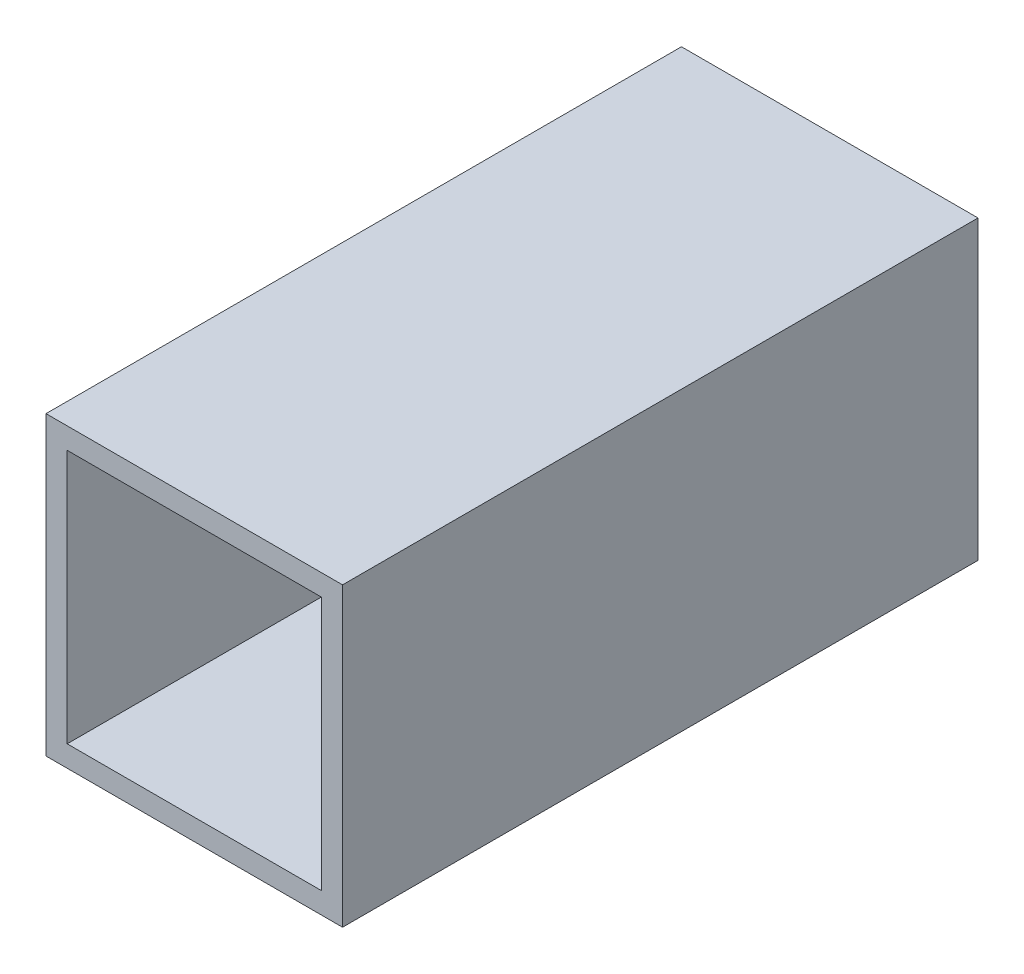
ISO-10303-21;
HEADER;
FILE_DESCRIPTION(('STEP AP214'),'2;1');
FILE_NAME('part.step','',(''),(''),'','','');
FILE_SCHEMA(('AUTOMOTIVE_DESIGN { 1 0 10303 214 1 1 1 1 }'));
ENDSEC;
DATA;
#1=APPLICATION_CONTEXT('core data for automotive mechanical design processes');
#2=APPLICATION_PROTOCOL_DEFINITION('international standard','automotive_design',2000,#1);
#3=PRODUCT_CONTEXT('',#1,'mechanical');
#4=PRODUCT('Part','Part','',(#3));
#5=PRODUCT_RELATED_PRODUCT_CATEGORY('part','',(#4));
#6=PRODUCT_DEFINITION_FORMATION('','',#4);
#7=PRODUCT_DEFINITION_CONTEXT('part definition',#1,'design');
#8=PRODUCT_DEFINITION('design','',#6,#7);
#9=PRODUCT_DEFINITION_SHAPE('','',#8);
#10=(LENGTH_UNIT() NAMED_UNIT(*) SI_UNIT(.MILLI.,.METRE.));
#11=(NAMED_UNIT(*) PLANE_ANGLE_UNIT() SI_UNIT($,.RADIAN.));
#12=(NAMED_UNIT(*) SI_UNIT($,.STERADIAN.) SOLID_ANGLE_UNIT());
#13=UNCERTAINTY_MEASURE_WITH_UNIT(LENGTH_MEASURE(1.E-05),#10,'distance_accuracy_value','');
#14=(GEOMETRIC_REPRESENTATION_CONTEXT(3) GLOBAL_UNCERTAINTY_ASSIGNED_CONTEXT((#13)) GLOBAL_UNIT_ASSIGNED_CONTEXT((#10,
#11,#12)) REPRESENTATION_CONTEXT('',''));
#15=CARTESIAN_POINT('',(0.,0.,0.));
#16=DIRECTION('',(0.,0.,1.));
#17=DIRECTION('',(1.,0.,0.));
#18=AXIS2_PLACEMENT_3D('',#15,#16,#17);
#19=CARTESIAN_POINT('',(0.,0.,95.25));
#20=DIRECTION('',(0.,0.,1.));
#21=DIRECTION('',(1.,0.,0.));
#22=AXIS2_PLACEMENT_3D('',#19,#20,#21);
#23=PLANE('',#22);
#24=DIRECTION('',(0.,1.,0.));
#25=VECTOR('',#24,1.);
#26=CARTESIAN_POINT('',(22.225,22.225,95.25));
#27=LINE('',#26,#25);
#28=CARTESIAN_POINT('',(22.225,-22.225,95.25));
#29=VERTEX_POINT('',#28);
#30=CARTESIAN_POINT('',(22.225,22.225,95.25));
#31=VERTEX_POINT('',#30);
#32=EDGE_CURVE('E134',#29,#31,#27,.T.);
#33=ORIENTED_EDGE('',*,*,#32,.T.);
#34=DIRECTION('',(-1.,0.,0.));
#35=VECTOR('',#34,1.);
#36=CARTESIAN_POINT('',(-22.225,22.225,95.25));
#37=LINE('',#36,#35);
#38=CARTESIAN_POINT('',(-22.225,22.225,95.25));
#39=VERTEX_POINT('',#38);
#40=EDGE_CURVE('E137',#31,#39,#37,.T.);
#41=ORIENTED_EDGE('',*,*,#40,.T.);
#42=DIRECTION('',(0.,-1.,0.));
#43=VECTOR('',#42,1.);
#44=CARTESIAN_POINT('',(-22.225,22.225,95.25));
#45=LINE('',#44,#43);
#46=CARTESIAN_POINT('',(-22.225,-22.225,95.25));
#47=VERTEX_POINT('',#46);
#48=EDGE_CURVE('E140',#39,#47,#45,.T.);
#49=ORIENTED_EDGE('',*,*,#48,.T.);
#50=DIRECTION('',(1.,0.,0.));
#51=VECTOR('',#50,1.);
#52=CARTESIAN_POINT('',(-22.225,-22.225,95.25));
#53=LINE('',#52,#51);
#54=EDGE_CURVE('E142',#47,#29,#53,.T.);
#55=ORIENTED_EDGE('',*,*,#54,.T.);
#56=EDGE_LOOP('',(#33,#41,#49,#55));
#57=FACE_BOUND('',#56,.T.);
#58=DIRECTION('',(-1.,0.,0.));
#59=VECTOR('',#58,1.);
#60=CARTESIAN_POINT('',(-19.05,19.05,95.25));
#61=LINE('',#60,#59);
#62=CARTESIAN_POINT('',(19.05,19.05,95.25));
#63=VERTEX_POINT('',#62);
#64=CARTESIAN_POINT('',(-19.05,19.05,95.25));
#65=VERTEX_POINT('',#64);
#66=EDGE_CURVE('E106',#63,#65,#61,.T.);
#67=ORIENTED_EDGE('',*,*,#66,.F.);
#68=DIRECTION('',(0.,1.,0.));
#69=VECTOR('',#68,1.);
#70=CARTESIAN_POINT('',(19.05,19.05,95.25));
#71=LINE('',#70,#69);
#72=CARTESIAN_POINT('',(19.05,-19.05,95.25));
#73=VERTEX_POINT('',#72);
#74=EDGE_CURVE('E98',#73,#63,#71,.T.);
#75=ORIENTED_EDGE('',*,*,#74,.F.);
#76=DIRECTION('',(1.,0.,0.));
#77=VECTOR('',#76,1.);
#78=CARTESIAN_POINT('',(-19.05,-19.05,95.25));
#79=LINE('',#78,#77);
#80=CARTESIAN_POINT('',(-19.05,-19.05,95.25));
#81=VERTEX_POINT('',#80);
#82=EDGE_CURVE('E120',#81,#73,#79,.T.);
#83=ORIENTED_EDGE('',*,*,#82,.F.);
#84=DIRECTION('',(0.,-1.,0.));
#85=VECTOR('',#84,1.);
#86=CARTESIAN_POINT('',(-19.05,19.05,95.25));
#87=LINE('',#86,#85);
#88=EDGE_CURVE('E118',#65,#81,#87,.T.);
#89=ORIENTED_EDGE('',*,*,#88,.F.);
#90=EDGE_LOOP('',(#67,#75,#83,#89));
#91=FACE_BOUND('',#90,.T.);
#92=ADVANCED_FACE('F33',(#57,#91),#23,.T.);
#93=CARTESIAN_POINT('',(0.,0.,0.));
#94=DIRECTION('',(0.,0.,1.));
#95=DIRECTION('',(1.,0.,0.));
#96=AXIS2_PLACEMENT_3D('',#93,#94,#95);
#97=PLANE('',#96);
#98=DIRECTION('',(0.,1.,0.));
#99=VECTOR('',#98,1.);
#100=CARTESIAN_POINT('',(22.225,22.225,0.));
#101=LINE('',#100,#99);
#102=CARTESIAN_POINT('',(22.225,-22.225,0.));
#103=VERTEX_POINT('',#102);
#104=CARTESIAN_POINT('',(22.225,22.225,0.));
#105=VERTEX_POINT('',#104);
#106=EDGE_CURVE('E114',#103,#105,#101,.T.);
#107=ORIENTED_EDGE('',*,*,#106,.F.);
#108=DIRECTION('',(1.,0.,0.));
#109=VECTOR('',#108,1.);
#110=CARTESIAN_POINT('',(-22.225,-22.225,0.));
#111=LINE('',#110,#109);
#112=CARTESIAN_POINT('',(-22.225,-22.225,0.));
#113=VERTEX_POINT('',#112);
#114=EDGE_CURVE('E138',#113,#103,#111,.T.);
#115=ORIENTED_EDGE('',*,*,#114,.F.);
#116=DIRECTION('',(0.,-1.,0.));
#117=VECTOR('',#116,1.);
#118=CARTESIAN_POINT('',(-22.225,22.225,0.));
#119=LINE('',#118,#117);
#120=CARTESIAN_POINT('',(-22.225,22.225,0.));
#121=VERTEX_POINT('',#120);
#122=EDGE_CURVE('E149',#121,#113,#119,.T.);
#123=ORIENTED_EDGE('',*,*,#122,.F.);
#124=DIRECTION('',(-1.,0.,0.));
#125=VECTOR('',#124,1.);
#126=CARTESIAN_POINT('',(-22.225,22.225,0.));
#127=LINE('',#126,#125);
#128=EDGE_CURVE('E147',#105,#121,#127,.T.);
#129=ORIENTED_EDGE('',*,*,#128,.F.);
#130=EDGE_LOOP('',(#107,#115,#123,#129));
#131=FACE_BOUND('',#130,.T.);
#132=DIRECTION('',(0.,1.,0.));
#133=VECTOR('',#132,1.);
#134=CARTESIAN_POINT('',(19.05,19.05,0.));
#135=LINE('',#134,#133);
#136=CARTESIAN_POINT('',(19.05,-19.05,0.));
#137=VERTEX_POINT('',#136);
#138=CARTESIAN_POINT('',(19.05,19.05,0.));
#139=VERTEX_POINT('',#138);
#140=EDGE_CURVE('E56',#137,#139,#135,.T.);
#141=ORIENTED_EDGE('',*,*,#140,.T.);
#142=DIRECTION('',(-1.,0.,0.));
#143=VECTOR('',#142,1.);
#144=CARTESIAN_POINT('',(-19.05,19.05,0.));
#145=LINE('',#144,#143);
#146=CARTESIAN_POINT('',(-19.05,19.05,0.));
#147=VERTEX_POINT('',#146);
#148=EDGE_CURVE('E113',#139,#147,#145,.T.);
#149=ORIENTED_EDGE('',*,*,#148,.T.);
#150=DIRECTION('',(0.,-1.,0.));
#151=VECTOR('',#150,1.);
#152=CARTESIAN_POINT('',(-19.05,19.05,0.));
#153=LINE('',#152,#151);
#154=CARTESIAN_POINT('',(-19.05,-19.05,0.));
#155=VERTEX_POINT('',#154);
#156=EDGE_CURVE('E126',#147,#155,#153,.T.);
#157=ORIENTED_EDGE('',*,*,#156,.T.);
#158=DIRECTION('',(1.,0.,0.));
#159=VECTOR('',#158,1.);
#160=CARTESIAN_POINT('',(-19.05,-19.05,0.));
#161=LINE('',#160,#159);
#162=EDGE_CURVE('E107',#155,#137,#161,.T.);
#163=ORIENTED_EDGE('',*,*,#162,.T.);
#164=EDGE_LOOP('',(#141,#149,#157,#163));
#165=FACE_BOUND('',#164,.T.);
#166=ADVANCED_FACE('F167',(#131,#165),#97,.F.);
#167=CARTESIAN_POINT('',(22.225,22.225,95.25));
#168=DIRECTION('',(-1.,0.,0.));
#169=DIRECTION('',(0.,-1.,0.));
#170=AXIS2_PLACEMENT_3D('',#167,#168,#169);
#171=PLANE('',#170);
#172=ORIENTED_EDGE('',*,*,#106,.T.);
#173=DIRECTION('',(0.,0.,-1.));
#174=VECTOR('',#173,1.);
#175=CARTESIAN_POINT('',(22.225,22.225,95.25));
#176=LINE('',#175,#174);
#177=EDGE_CURVE('E11',#31,#105,#176,.T.);
#178=ORIENTED_EDGE('',*,*,#177,.F.);
#179=ORIENTED_EDGE('',*,*,#32,.F.);
#180=DIRECTION('',(0.,0.,-1.));
#181=VECTOR('',#180,1.);
#182=CARTESIAN_POINT('',(22.225,-22.225,95.25));
#183=LINE('',#182,#181);
#184=EDGE_CURVE('E144',#29,#103,#183,.T.);
#185=ORIENTED_EDGE('',*,*,#184,.T.);
#186=EDGE_LOOP('',(#172,#178,#179,#185));
#187=FACE_BOUND('',#186,.T.);
#188=ADVANCED_FACE('F35',(#187),#171,.F.);
#189=CARTESIAN_POINT('',(-22.225,22.225,95.25));
#190=DIRECTION('',(0.,-1.,0.));
#191=DIRECTION('',(0.,0.,-1.));
#192=AXIS2_PLACEMENT_3D('',#189,#190,#191);
#193=PLANE('',#192);
#194=ORIENTED_EDGE('',*,*,#128,.T.);
#195=DIRECTION('',(0.,0.,-1.));
#196=VECTOR('',#195,1.);
#197=CARTESIAN_POINT('',(-22.225,22.225,95.25));
#198=LINE('',#197,#196);
#199=EDGE_CURVE('E41',#39,#121,#198,.T.);
#200=ORIENTED_EDGE('',*,*,#199,.F.);
#201=ORIENTED_EDGE('',*,*,#40,.F.);
#202=ORIENTED_EDGE('',*,*,#177,.T.);
#203=EDGE_LOOP('',(#194,#200,#201,#202));
#204=FACE_BOUND('',#203,.T.);
#205=ADVANCED_FACE('F177',(#204),#193,.F.);
#206=CARTESIAN_POINT('',(-22.225,22.225,95.25));
#207=DIRECTION('',(1.,0.,0.));
#208=DIRECTION('',(0.,1.,0.));
#209=AXIS2_PLACEMENT_3D('',#206,#207,#208);
#210=PLANE('',#209);
#211=ORIENTED_EDGE('',*,*,#122,.T.);
#212=DIRECTION('',(0.,0.,-1.));
#213=VECTOR('',#212,1.);
#214=CARTESIAN_POINT('',(-22.225,-22.225,95.25));
#215=LINE('',#214,#213);
#216=EDGE_CURVE('E154',#47,#113,#215,.T.);
#217=ORIENTED_EDGE('',*,*,#216,.F.);
#218=ORIENTED_EDGE('',*,*,#48,.F.);
#219=ORIENTED_EDGE('',*,*,#199,.T.);
#220=EDGE_LOOP('',(#211,#217,#218,#219));
#221=FACE_BOUND('',#220,.T.);
#222=ADVANCED_FACE('F161',(#221),#210,.F.);
#223=CARTESIAN_POINT('',(-22.225,-22.225,95.25));
#224=DIRECTION('',(0.,1.,0.));
#225=DIRECTION('',(0.,0.,1.));
#226=AXIS2_PLACEMENT_3D('',#223,#224,#225);
#227=PLANE('',#226);
#228=ORIENTED_EDGE('',*,*,#114,.T.);
#229=ORIENTED_EDGE('',*,*,#184,.F.);
#230=ORIENTED_EDGE('',*,*,#54,.F.);
#231=ORIENTED_EDGE('',*,*,#216,.T.);
#232=EDGE_LOOP('',(#228,#229,#230,#231));
#233=FACE_BOUND('',#232,.T.);
#234=ADVANCED_FACE('F171',(#233),#227,.F.);
#235=CARTESIAN_POINT('',(19.05,19.05,95.25));
#236=DIRECTION('',(-1.,0.,0.));
#237=DIRECTION('',(0.,-1.,0.));
#238=AXIS2_PLACEMENT_3D('',#235,#236,#237);
#239=PLANE('',#238);
#240=ORIENTED_EDGE('',*,*,#140,.F.);
#241=DIRECTION('',(0.,0.,-1.));
#242=VECTOR('',#241,1.);
#243=CARTESIAN_POINT('',(19.05,-19.05,95.25));
#244=LINE('',#243,#242);
#245=EDGE_CURVE('E102',#73,#137,#244,.T.);
#246=ORIENTED_EDGE('',*,*,#245,.F.);
#247=ORIENTED_EDGE('',*,*,#74,.T.);
#248=DIRECTION('',(0.,0.,-1.));
#249=VECTOR('',#248,1.);
#250=CARTESIAN_POINT('',(19.05,19.05,95.25));
#251=LINE('',#250,#249);
#252=EDGE_CURVE('E101',#63,#139,#251,.T.);
#253=ORIENTED_EDGE('',*,*,#252,.T.);
#254=EDGE_LOOP('',(#240,#246,#247,#253));
#255=FACE_BOUND('',#254,.T.);
#256=ADVANCED_FACE('F100',(#255),#239,.T.);
#257=CARTESIAN_POINT('',(-19.05,19.05,95.25));
#258=DIRECTION('',(0.,-1.,0.));
#259=DIRECTION('',(1.,0.,0.));
#260=AXIS2_PLACEMENT_3D('',#257,#258,#259);
#261=PLANE('',#260);
#262=ORIENTED_EDGE('',*,*,#148,.F.);
#263=ORIENTED_EDGE('',*,*,#252,.F.);
#264=ORIENTED_EDGE('',*,*,#66,.T.);
#265=DIRECTION('',(0.,0.,-1.));
#266=VECTOR('',#265,1.);
#267=CARTESIAN_POINT('',(-19.05,19.05,95.25));
#268=LINE('',#267,#266);
#269=EDGE_CURVE('E115',#65,#147,#268,.T.);
#270=ORIENTED_EDGE('',*,*,#269,.T.);
#271=EDGE_LOOP('',(#262,#263,#264,#270));
#272=FACE_BOUND('',#271,.T.);
#273=ADVANCED_FACE('F110',(#272),#261,.T.);
#274=CARTESIAN_POINT('',(-19.05,19.05,95.25));
#275=DIRECTION('',(1.,0.,0.));
#276=DIRECTION('',(0.,1.,0.));
#277=AXIS2_PLACEMENT_3D('',#274,#275,#276);
#278=PLANE('',#277);
#279=ORIENTED_EDGE('',*,*,#156,.F.);
#280=ORIENTED_EDGE('',*,*,#269,.F.);
#281=ORIENTED_EDGE('',*,*,#88,.T.);
#282=DIRECTION('',(0.,0.,-1.));
#283=VECTOR('',#282,1.);
#284=CARTESIAN_POINT('',(-19.05,-19.05,95.25));
#285=LINE('',#284,#283);
#286=EDGE_CURVE('E48',#81,#155,#285,.T.);
#287=ORIENTED_EDGE('',*,*,#286,.T.);
#288=EDGE_LOOP('',(#279,#280,#281,#287));
#289=FACE_BOUND('',#288,.T.);
#290=ADVANCED_FACE('F200',(#289),#278,.T.);
#291=CARTESIAN_POINT('',(-19.05,-19.05,95.25));
#292=DIRECTION('',(0.,1.,0.));
#293=DIRECTION('',(0.,0.,1.));
#294=AXIS2_PLACEMENT_3D('',#291,#292,#293);
#295=PLANE('',#294);
#296=ORIENTED_EDGE('',*,*,#162,.F.);
#297=ORIENTED_EDGE('',*,*,#286,.F.);
#298=ORIENTED_EDGE('',*,*,#82,.T.);
#299=ORIENTED_EDGE('',*,*,#245,.T.);
#300=EDGE_LOOP('',(#296,#297,#298,#299));
#301=FACE_BOUND('',#300,.T.);
#302=ADVANCED_FACE('F204',(#301),#295,.T.);
#303=CLOSED_SHELL('',(#92,#166,#188,#205,#222,#234,#256,#273,#290,#302));
#304=MANIFOLD_SOLID_BREP('B2',#303);
#305=ADVANCED_BREP_SHAPE_REPRESENTATION('',(#18,#304),#14);
#306=SHAPE_DEFINITION_REPRESENTATION(#9,#305);
ENDSEC;
END-ISO-10303-21;
